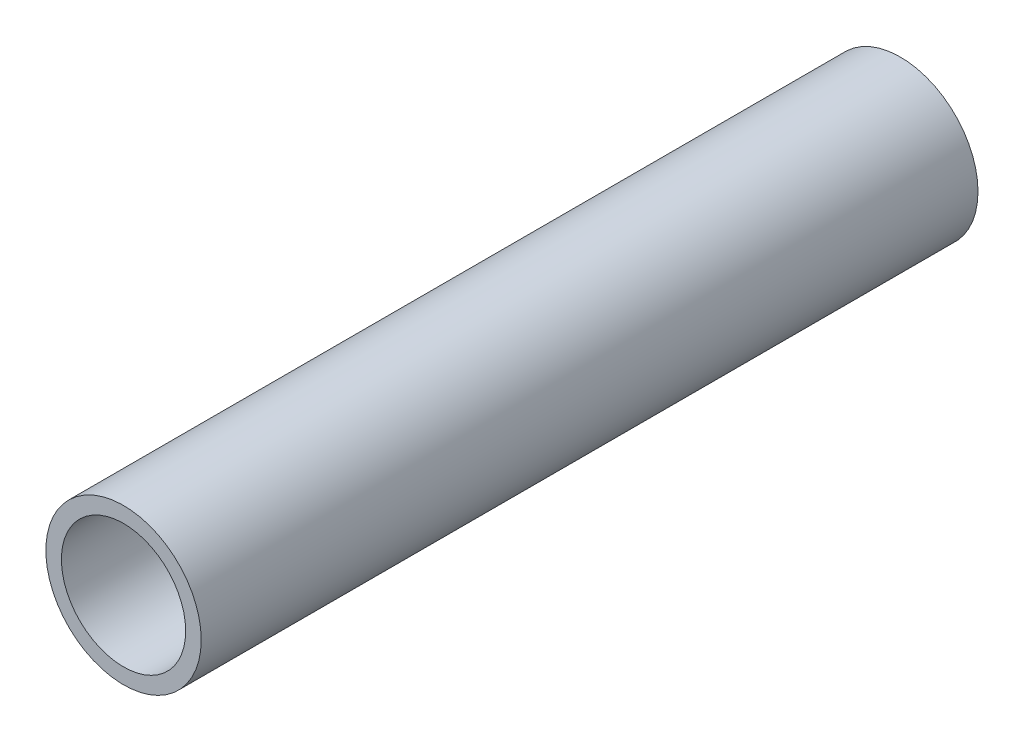
ISO-10303-21;
HEADER;
FILE_DESCRIPTION(('STEP AP214'),'2;1');
FILE_NAME('part.step','',(''),(''),'','','');
FILE_SCHEMA(('AUTOMOTIVE_DESIGN { 1 0 10303 214 1 1 1 1 }'));
ENDSEC;
DATA;
#1=APPLICATION_CONTEXT('core data for automotive mechanical design processes');
#2=APPLICATION_PROTOCOL_DEFINITION('international standard','automotive_design',2000,#1);
#3=PRODUCT_CONTEXT('',#1,'mechanical');
#4=PRODUCT('Part','Part','',(#3));
#5=PRODUCT_RELATED_PRODUCT_CATEGORY('part','',(#4));
#6=PRODUCT_DEFINITION_FORMATION('','',#4);
#7=PRODUCT_DEFINITION_CONTEXT('part definition',#1,'design');
#8=PRODUCT_DEFINITION('design','',#6,#7);
#9=PRODUCT_DEFINITION_SHAPE('','',#8);
#10=(LENGTH_UNIT() NAMED_UNIT(*) SI_UNIT(.MILLI.,.METRE.));
#11=(NAMED_UNIT(*) PLANE_ANGLE_UNIT() SI_UNIT($,.RADIAN.));
#12=(NAMED_UNIT(*) SI_UNIT($,.STERADIAN.) SOLID_ANGLE_UNIT());
#13=UNCERTAINTY_MEASURE_WITH_UNIT(LENGTH_MEASURE(1.E-05),#10,'distance_accuracy_value','');
#14=(GEOMETRIC_REPRESENTATION_CONTEXT(3) GLOBAL_UNCERTAINTY_ASSIGNED_CONTEXT((#13)) GLOBAL_UNIT_ASSIGNED_CONTEXT((#10,
#11,#12)) REPRESENTATION_CONTEXT('',''));
#15=CARTESIAN_POINT('',(0.,0.,0.));
#16=DIRECTION('',(0.,0.,1.));
#17=DIRECTION('',(1.,0.,0.));
#18=AXIS2_PLACEMENT_3D('',#15,#16,#17);
#19=CARTESIAN_POINT('',(0.,0.,200.));
#20=DIRECTION('',(0.,0.,1.));
#21=DIRECTION('',(1.,0.,0.));
#22=AXIS2_PLACEMENT_3D('',#19,#20,#21);
#23=PLANE('',#22);
#24=CARTESIAN_POINT('',(0.,0.,200.));
#25=DIRECTION('',(0.,0.,1.));
#26=DIRECTION('',(1.,0.,0.));
#27=AXIS2_PLACEMENT_3D('',#24,#25,#26);
#28=CIRCLE('',#27,20.);
#29=CARTESIAN_POINT('',(20.,0.,200.));
#30=VERTEX_POINT('',#29);
#31=EDGE_CURVE('E10',#30,#30,#28,.T.);
#32=ORIENTED_EDGE('',*,*,#31,.T.);
#33=EDGE_LOOP('',(#32));
#34=FACE_BOUND('',#33,.T.);
#35=CARTESIAN_POINT('',(0.,0.,200.));
#36=DIRECTION('',(0.,0.,1.));
#37=DIRECTION('',(1.,0.,0.));
#38=AXIS2_PLACEMENT_3D('',#35,#36,#37);
#39=CIRCLE('',#38,16.);
#40=CARTESIAN_POINT('',(16.,0.,200.));
#41=VERTEX_POINT('',#40);
#42=EDGE_CURVE('E48',#41,#41,#39,.T.);
#43=ORIENTED_EDGE('',*,*,#42,.F.);
#44=EDGE_LOOP('',(#43));
#45=FACE_BOUND('',#44,.T.);
#46=ADVANCED_FACE('F40',(#34,#45),#23,.T.);
#47=CARTESIAN_POINT('',(0.,0.,0.));
#48=DIRECTION('',(0.,0.,1.));
#49=DIRECTION('',(1.,0.,0.));
#50=AXIS2_PLACEMENT_3D('',#47,#48,#49);
#51=PLANE('',#50);
#52=CARTESIAN_POINT('',(0.,0.,0.));
#53=DIRECTION('',(0.,0.,1.));
#54=DIRECTION('',(1.,0.,0.));
#55=AXIS2_PLACEMENT_3D('',#52,#53,#54);
#56=CIRCLE('',#55,20.);
#57=CARTESIAN_POINT('',(20.,0.,0.));
#58=VERTEX_POINT('',#57);
#59=EDGE_CURVE('E41',#58,#58,#56,.T.);
#60=ORIENTED_EDGE('',*,*,#59,.F.);
#61=EDGE_LOOP('',(#60));
#62=FACE_BOUND('',#61,.T.);
#63=CARTESIAN_POINT('',(0.,0.,0.));
#64=DIRECTION('',(0.,0.,1.));
#65=DIRECTION('',(1.,0.,0.));
#66=AXIS2_PLACEMENT_3D('',#63,#64,#65);
#67=CIRCLE('',#66,16.);
#68=CARTESIAN_POINT('',(16.,0.,0.));
#69=VERTEX_POINT('',#68);
#70=EDGE_CURVE('E49',#69,#69,#67,.T.);
#71=ORIENTED_EDGE('',*,*,#70,.T.);
#72=EDGE_LOOP('',(#71));
#73=FACE_BOUND('',#72,.T.);
#74=ADVANCED_FACE('F58',(#62,#73),#51,.F.);
#75=CARTESIAN_POINT('',(0.,0.,200.));
#76=DIRECTION('',(0.,0.,-1.));
#77=DIRECTION('',(-1.,0.,0.));
#78=AXIS2_PLACEMENT_3D('',#75,#76,#77);
#79=CYLINDRICAL_SURFACE('',#78,20.);
#80=ORIENTED_EDGE('',*,*,#31,.F.);
#81=EDGE_LOOP('',(#80));
#82=FACE_BOUND('',#81,.T.);
#83=ORIENTED_EDGE('',*,*,#59,.T.);
#84=EDGE_LOOP('',(#83));
#85=FACE_BOUND('',#84,.T.);
#86=ADVANCED_FACE('F39',(#82,#85),#79,.T.);
#87=CARTESIAN_POINT('',(0.,0.,200.));
#88=DIRECTION('',(0.,0.,-1.));
#89=DIRECTION('',(-1.,0.,0.));
#90=AXIS2_PLACEMENT_3D('',#87,#88,#89);
#91=CYLINDRICAL_SURFACE('',#90,16.);
#92=ORIENTED_EDGE('',*,*,#42,.T.);
#93=EDGE_LOOP('',(#92));
#94=FACE_BOUND('',#93,.T.);
#95=ORIENTED_EDGE('',*,*,#70,.F.);
#96=EDGE_LOOP('',(#95));
#97=FACE_BOUND('',#96,.T.);
#98=ADVANCED_FACE('F57',(#94,#97),#91,.F.);
#99=CLOSED_SHELL('',(#46,#74,#86,#98));
#100=MANIFOLD_SOLID_BREP('B2',#99);
#101=ADVANCED_BREP_SHAPE_REPRESENTATION('',(#18,#100),#14);
#102=SHAPE_DEFINITION_REPRESENTATION(#9,#101);
ENDSEC;
END-ISO-10303-21;
